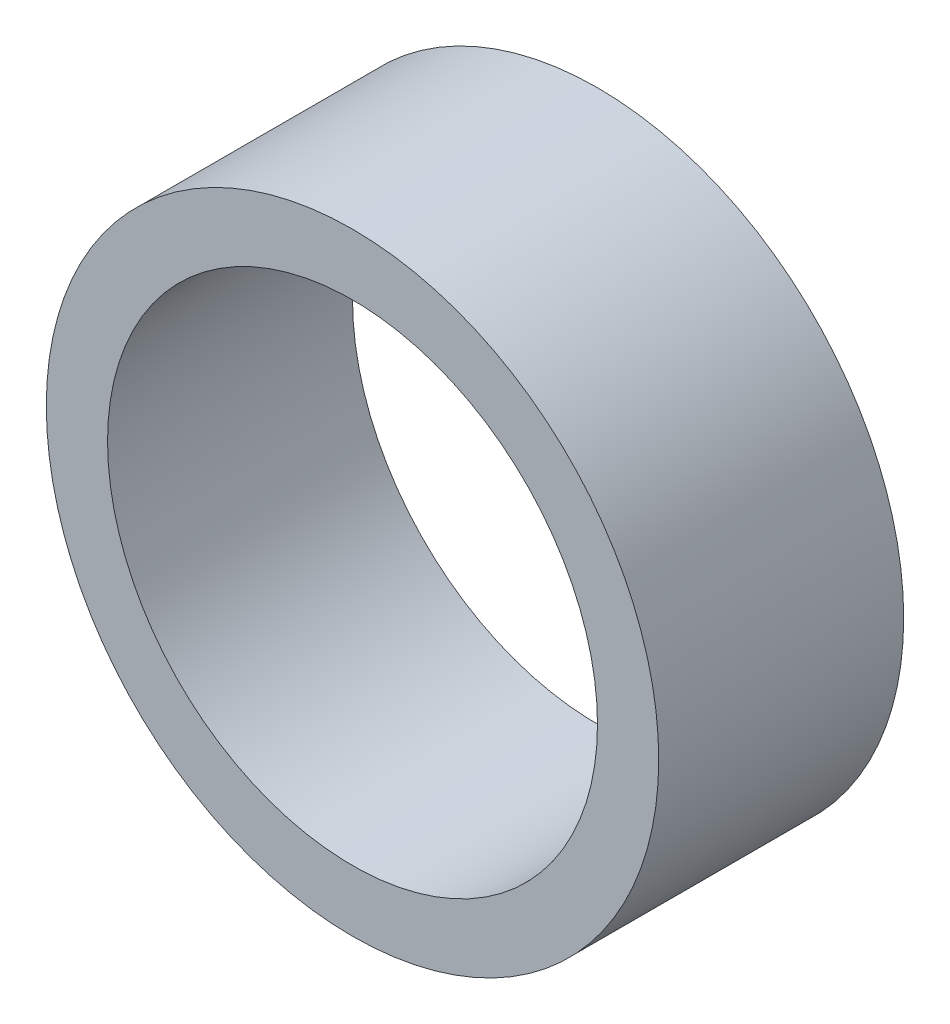
ISO-10303-21;
HEADER;
FILE_DESCRIPTION(('STEP AP214'),'2;1');
FILE_NAME('part.step','',(''),(''),'','','');
FILE_SCHEMA(('AUTOMOTIVE_DESIGN { 1 0 10303 214 1 1 1 1 }'));
ENDSEC;
DATA;
#1=APPLICATION_CONTEXT('core data for automotive mechanical design processes');
#2=APPLICATION_PROTOCOL_DEFINITION('international standard','automotive_design',2000,#1);
#3=PRODUCT_CONTEXT('',#1,'mechanical');
#4=PRODUCT('Part','Part','',(#3));
#5=PRODUCT_RELATED_PRODUCT_CATEGORY('part','',(#4));
#6=PRODUCT_DEFINITION_FORMATION('','',#4);
#7=PRODUCT_DEFINITION_CONTEXT('part definition',#1,'design');
#8=PRODUCT_DEFINITION('design','',#6,#7);
#9=PRODUCT_DEFINITION_SHAPE('','',#8);
#10=(LENGTH_UNIT() NAMED_UNIT(*) SI_UNIT(.MILLI.,.METRE.));
#11=(NAMED_UNIT(*) PLANE_ANGLE_UNIT() SI_UNIT($,.RADIAN.));
#12=(NAMED_UNIT(*) SI_UNIT($,.STERADIAN.) SOLID_ANGLE_UNIT());
#13=UNCERTAINTY_MEASURE_WITH_UNIT(LENGTH_MEASURE(1.E-05),#10,'distance_accuracy_value','');
#14=(GEOMETRIC_REPRESENTATION_CONTEXT(3) GLOBAL_UNCERTAINTY_ASSIGNED_CONTEXT((#13)) GLOBAL_UNIT_ASSIGNED_CONTEXT((#10,
#11,#12)) REPRESENTATION_CONTEXT('',''));
#15=CARTESIAN_POINT('',(0.,0.,0.));
#16=DIRECTION('',(0.,0.,1.));
#17=DIRECTION('',(1.,0.,0.));
#18=AXIS2_PLACEMENT_3D('',#15,#16,#17);
#19=CARTESIAN_POINT('',(0.,0.,6.35));
#20=DIRECTION('',(0.,0.,1.));
#21=DIRECTION('',(1.,0.,0.));
#22=AXIS2_PLACEMENT_3D('',#19,#20,#21);
#23=PLANE('',#22);
#24=CARTESIAN_POINT('',(0.,0.,6.35));
#25=DIRECTION('',(0.,0.,1.));
#26=DIRECTION('',(1.,0.,0.));
#27=AXIS2_PLACEMENT_3D('',#24,#25,#26);
#28=CIRCLE('',#27,7.9375);
#29=CARTESIAN_POINT('',(7.9375,0.,6.35));
#30=VERTEX_POINT('',#29);
#31=EDGE_CURVE('E10',#30,#30,#28,.T.);
#32=ORIENTED_EDGE('',*,*,#31,.T.);
#33=EDGE_LOOP('',(#32));
#34=FACE_BOUND('',#33,.T.);
#35=CARTESIAN_POINT('',(0.,0.,6.35));
#36=DIRECTION('',(0.,0.,1.));
#37=DIRECTION('',(1.,0.,0.));
#38=AXIS2_PLACEMENT_3D('',#35,#36,#37);
#39=CIRCLE('',#38,6.35);
#40=CARTESIAN_POINT('',(6.35,0.,6.35));
#41=VERTEX_POINT('',#40);
#42=EDGE_CURVE('E50',#41,#41,#39,.T.);
#43=ORIENTED_EDGE('',*,*,#42,.F.);
#44=EDGE_LOOP('',(#43));
#45=FACE_BOUND('',#44,.T.);
#46=ADVANCED_FACE('F37',(#34,#45),#23,.T.);
#47=CARTESIAN_POINT('',(0.,0.,0.));
#48=DIRECTION('',(0.,0.,1.));
#49=DIRECTION('',(1.,0.,0.));
#50=AXIS2_PLACEMENT_3D('',#47,#48,#49);
#51=PLANE('',#50);
#52=CARTESIAN_POINT('',(0.,0.,0.));
#53=DIRECTION('',(0.,0.,1.));
#54=DIRECTION('',(1.,0.,0.));
#55=AXIS2_PLACEMENT_3D('',#52,#53,#54);
#56=CIRCLE('',#55,7.9375);
#57=CARTESIAN_POINT('',(7.9375,0.,0.));
#58=VERTEX_POINT('',#57);
#59=EDGE_CURVE('E41',#58,#58,#56,.T.);
#60=ORIENTED_EDGE('',*,*,#59,.F.);
#61=EDGE_LOOP('',(#60));
#62=FACE_BOUND('',#61,.T.);
#63=CARTESIAN_POINT('',(0.,0.,0.));
#64=DIRECTION('',(0.,0.,1.));
#65=DIRECTION('',(1.,0.,0.));
#66=AXIS2_PLACEMENT_3D('',#63,#64,#65);
#67=CIRCLE('',#66,6.35);
#68=CARTESIAN_POINT('',(6.35,0.,0.));
#69=VERTEX_POINT('',#68);
#70=EDGE_CURVE('E52',#69,#69,#67,.T.);
#71=ORIENTED_EDGE('',*,*,#70,.T.);
#72=EDGE_LOOP('',(#71));
#73=FACE_BOUND('',#72,.T.);
#74=ADVANCED_FACE('F64',(#62,#73),#51,.F.);
#75=CARTESIAN_POINT('',(0.,0.,6.35));
#76=DIRECTION('',(0.,0.,-1.));
#77=DIRECTION('',(-1.,0.,0.));
#78=AXIS2_PLACEMENT_3D('',#75,#76,#77);
#79=CYLINDRICAL_SURFACE('',#78,7.9375);
#80=ORIENTED_EDGE('',*,*,#31,.F.);
#81=EDGE_LOOP('',(#80));
#82=FACE_BOUND('',#81,.T.);
#83=ORIENTED_EDGE('',*,*,#59,.T.);
#84=EDGE_LOOP('',(#83));
#85=FACE_BOUND('',#84,.T.);
#86=ADVANCED_FACE('F39',(#82,#85),#79,.T.);
#87=CARTESIAN_POINT('',(0.,0.,6.35));
#88=DIRECTION('',(0.,0.,-1.));
#89=DIRECTION('',(-1.,0.,0.));
#90=AXIS2_PLACEMENT_3D('',#87,#88,#89);
#91=CYLINDRICAL_SURFACE('',#90,6.35);
#92=ORIENTED_EDGE('',*,*,#42,.T.);
#93=EDGE_LOOP('',(#92));
#94=FACE_BOUND('',#93,.T.);
#95=ORIENTED_EDGE('',*,*,#70,.F.);
#96=EDGE_LOOP('',(#95));
#97=FACE_BOUND('',#96,.T.);
#98=ADVANCED_FACE('F60',(#94,#97),#91,.F.);
#99=CLOSED_SHELL('',(#46,#74,#86,#98));
#100=MANIFOLD_SOLID_BREP('B2',#99);
#101=ADVANCED_BREP_SHAPE_REPRESENTATION('',(#18,#100),#14);
#102=SHAPE_DEFINITION_REPRESENTATION(#9,#101);
ENDSEC;
END-ISO-10303-21;
